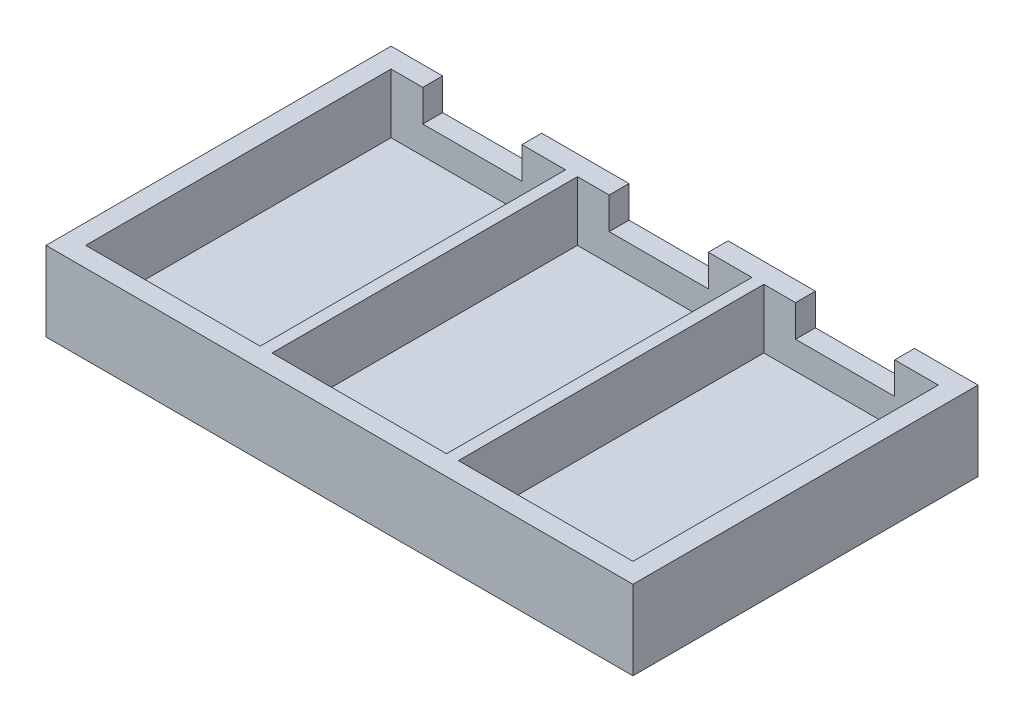
ISO-10303-21;
HEADER;
FILE_DESCRIPTION(('STEP AP214'),'2;1');
FILE_NAME('part.step','',(''),(''),'','','');
FILE_SCHEMA(('AUTOMOTIVE_DESIGN { 1 0 10303 214 1 1 1 1 }'));
ENDSEC;
DATA;
#1=APPLICATION_CONTEXT('core data for automotive mechanical design processes');
#2=APPLICATION_PROTOCOL_DEFINITION('international standard','automotive_design',2000,#1);
#3=PRODUCT_CONTEXT('',#1,'mechanical');
#4=PRODUCT('Part','Part','',(#3));
#5=PRODUCT_RELATED_PRODUCT_CATEGORY('part','',(#4));
#6=PRODUCT_DEFINITION_FORMATION('','',#4);
#7=PRODUCT_DEFINITION_CONTEXT('part definition',#1,'design');
#8=PRODUCT_DEFINITION('design','',#6,#7);
#9=PRODUCT_DEFINITION_SHAPE('','',#8);
#10=(LENGTH_UNIT() NAMED_UNIT(*) SI_UNIT(.MILLI.,.METRE.));
#11=(NAMED_UNIT(*) PLANE_ANGLE_UNIT() SI_UNIT($,.RADIAN.));
#12=(NAMED_UNIT(*) SI_UNIT($,.STERADIAN.) SOLID_ANGLE_UNIT());
#13=UNCERTAINTY_MEASURE_WITH_UNIT(LENGTH_MEASURE(1.E-05),#10,'distance_accuracy_value','');
#14=(GEOMETRIC_REPRESENTATION_CONTEXT(3) GLOBAL_UNCERTAINTY_ASSIGNED_CONTEXT((#13)) GLOBAL_UNIT_ASSIGNED_CONTEXT((#10,
#11,#12)) REPRESENTATION_CONTEXT('',''));
#15=CARTESIAN_POINT('',(0.,0.,0.));
#16=DIRECTION('',(0.,0.,1.));
#17=DIRECTION('',(1.,0.,0.));
#18=AXIS2_PLACEMENT_3D('',#15,#16,#17);
#19=CARTESIAN_POINT('',(0.,20.,38.5));
#20=DIRECTION('',(0.,0.,-1.));
#21=DIRECTION('',(-1.,0.,0.));
#22=AXIS2_PLACEMENT_3D('',#19,#20,#21);
#23=PLANE('',#22);
#24=DIRECTION('',(0.,1.,0.));
#25=VECTOR('',#24,1.);
#26=CARTESIAN_POINT('',(99.,-0.00199999999999853,38.5));
#27=LINE('',#26,#25);
#28=CARTESIAN_POINT('',(99.,5.,38.5));
#29=VERTEX_POINT('',#28);
#30=CARTESIAN_POINT('',(99.,20.,38.5));
#31=VERTEX_POINT('',#30);
#32=EDGE_CURVE('E369',#29,#31,#27,.T.);
#33=ORIENTED_EDGE('',*,*,#32,.T.);
#34=DIRECTION('',(1.,0.,0.));
#35=VECTOR('',#34,1.);
#36=CARTESIAN_POINT('',(0.,20.,38.5));
#37=LINE('',#36,#35);
#38=CARTESIAN_POINT('',(143.,20.,38.4999999999999));
#39=VERTEX_POINT('',#38);
#40=EDGE_CURVE('E445',#31,#39,#37,.T.);
#41=ORIENTED_EDGE('',*,*,#40,.T.);
#42=DIRECTION('',(0.,-1.,0.));
#43=VECTOR('',#42,1.);
#44=CARTESIAN_POINT('',(143.,20.,38.4999999999999));
#45=LINE('',#44,#43);
#46=CARTESIAN_POINT('',(143.,5.,38.4999999999999));
#47=VERTEX_POINT('',#46);
#48=EDGE_CURVE('E416',#39,#47,#45,.T.);
#49=ORIENTED_EDGE('',*,*,#48,.T.);
#50=DIRECTION('',(1.,0.,0.));
#51=VECTOR('',#50,1.);
#52=CARTESIAN_POINT('',(0.,5.,38.5));
#53=LINE('',#52,#51);
#54=EDGE_CURVE('E392',#29,#47,#53,.T.);
#55=ORIENTED_EDGE('',*,*,#54,.F.);
#56=EDGE_LOOP('',(#33,#41,#49,#55));
#57=FACE_BOUND('',#56,.T.);
#58=ADVANCED_FACE('F48',(#57),#23,.T.);
#59=CARTESIAN_POINT('',(148.,20.,-38.5));
#60=DIRECTION('',(0.,0.,1.));
#61=DIRECTION('',(1.,0.,0.));
#62=AXIS2_PLACEMENT_3D('',#59,#60,#61);
#63=PLANE('',#62);
#64=DIRECTION('',(0.,1.,0.));
#65=VECTOR('',#64,1.);
#66=CARTESIAN_POINT('',(107.,-20.4950975679639,-38.5));
#67=LINE('',#66,#65);
#68=CARTESIAN_POINT('',(107.,12.,-38.5));
#69=VERTEX_POINT('',#68);
#70=CARTESIAN_POINT('',(107.,20.,-38.5));
#71=VERTEX_POINT('',#70);
#72=EDGE_CURVE('E328',#69,#71,#67,.T.);
#73=ORIENTED_EDGE('',*,*,#72,.T.);
#74=DIRECTION('',(-1.,0.,0.));
#75=VECTOR('',#74,1.);
#76=CARTESIAN_POINT('',(148.,20.,-38.5));
#77=LINE('',#76,#75);
#78=CARTESIAN_POINT('',(99.,20.,-38.5));
#79=VERTEX_POINT('',#78);
#80=EDGE_CURVE('E457',#71,#79,#77,.T.);
#81=ORIENTED_EDGE('',*,*,#80,.T.);
#82=DIRECTION('',(0.,1.,0.));
#83=VECTOR('',#82,1.);
#84=CARTESIAN_POINT('',(99.,-0.00199999999999853,-38.5));
#85=LINE('',#84,#83);
#86=CARTESIAN_POINT('',(99.,5.,-38.5));
#87=VERTEX_POINT('',#86);
#88=EDGE_CURVE('E364',#87,#79,#85,.T.);
#89=ORIENTED_EDGE('',*,*,#88,.F.);
#90=DIRECTION('',(-1.,0.,0.));
#91=VECTOR('',#90,1.);
#92=CARTESIAN_POINT('',(148.,5.,-38.5));
#93=LINE('',#92,#91);
#94=CARTESIAN_POINT('',(143.,5.,-38.5));
#95=VERTEX_POINT('',#94);
#96=EDGE_CURVE('E434',#95,#87,#93,.T.);
#97=ORIENTED_EDGE('',*,*,#96,.F.);
#98=DIRECTION('',(0.,-1.,0.));
#99=VECTOR('',#98,1.);
#100=CARTESIAN_POINT('',(143.,20.,-38.5));
#101=LINE('',#100,#99);
#102=CARTESIAN_POINT('',(143.,20.,-38.5));
#103=VERTEX_POINT('',#102);
#104=EDGE_CURVE('E421',#103,#95,#101,.T.);
#105=ORIENTED_EDGE('',*,*,#104,.F.);
#106=CARTESIAN_POINT('',(132.,20.,-38.5));
#107=VERTEX_POINT('',#106);
#108=EDGE_CURVE('E453',#103,#107,#77,.T.);
#109=ORIENTED_EDGE('',*,*,#108,.T.);
#110=DIRECTION('',(0.,1.,0.));
#111=VECTOR('',#110,1.);
#112=CARTESIAN_POINT('',(132.,-20.4950975679639,-38.5));
#113=LINE('',#112,#111);
#114=CARTESIAN_POINT('',(132.,12.,-38.5));
#115=VERTEX_POINT('',#114);
#116=EDGE_CURVE('E64',#115,#107,#113,.T.);
#117=ORIENTED_EDGE('',*,*,#116,.F.);
#118=DIRECTION('',(-1.,0.,0.));
#119=VECTOR('',#118,1.);
#120=CARTESIAN_POINT('',(107.,12.,-38.5));
#121=LINE('',#120,#119);
#122=EDGE_CURVE('E323',#115,#69,#121,.T.);
#123=ORIENTED_EDGE('',*,*,#122,.T.);
#124=EDGE_LOOP('',(#73,#81,#89,#97,#105,#109,#117,#123));
#125=FACE_BOUND('',#124,.T.);
#126=ADVANCED_FACE('F508',(#125),#63,.T.);
#127=CARTESIAN_POINT('',(0.,5.,0.));
#128=DIRECTION('',(0.,1.,0.));
#129=DIRECTION('',(0.,0.,1.));
#130=AXIS2_PLACEMENT_3D('',#127,#128,#129);
#131=PLANE('',#130);
#132=DIRECTION('',(0.,0.,1.));
#133=VECTOR('',#132,1.);
#134=CARTESIAN_POINT('',(99.,5.,38.5));
#135=LINE('',#134,#133);
#136=EDGE_CURVE('E353',#87,#29,#135,.T.);
#137=ORIENTED_EDGE('',*,*,#136,.T.);
#138=ORIENTED_EDGE('',*,*,#54,.T.);
#139=DIRECTION('',(0.,0.,-1.));
#140=VECTOR('',#139,1.);
#141=CARTESIAN_POINT('',(143.,5.,43.4999999999999));
#142=LINE('',#141,#140);
#143=EDGE_CURVE('E414',#47,#95,#142,.T.);
#144=ORIENTED_EDGE('',*,*,#143,.T.);
#145=ORIENTED_EDGE('',*,*,#96,.T.);
#146=EDGE_LOOP('',(#137,#138,#144,#145));
#147=FACE_BOUND('',#146,.T.);
#148=ADVANCED_FACE('F518',(#147),#131,.T.);
#149=DIRECTION('',(0.,1.,0.));
#150=VECTOR('',#149,1.);
#151=CARTESIAN_POINT('',(96.,-0.00199999999999853,38.5));
#152=LINE('',#151,#150);
#153=CARTESIAN_POINT('',(96.,5.,38.5));
#154=VERTEX_POINT('',#153);
#155=CARTESIAN_POINT('',(96.,20.,38.5));
#156=VERTEX_POINT('',#155);
#157=EDGE_CURVE('E360',#154,#156,#152,.T.);
#158=ORIENTED_EDGE('',*,*,#157,.F.);
#159=CARTESIAN_POINT('',(52.,5.,38.5));
#160=VERTEX_POINT('',#159);
#161=EDGE_CURVE('E415',#160,#154,#53,.T.);
#162=ORIENTED_EDGE('',*,*,#161,.F.);
#163=DIRECTION('',(0.,1.,0.));
#164=VECTOR('',#163,1.);
#165=CARTESIAN_POINT('',(52.,-0.00199999999999853,38.5));
#166=LINE('',#165,#164);
#167=CARTESIAN_POINT('',(52.,20.,38.5));
#168=VERTEX_POINT('',#167);
#169=EDGE_CURVE('E401',#160,#168,#166,.T.);
#170=ORIENTED_EDGE('',*,*,#169,.T.);
#171=EDGE_CURVE('E450',#168,#156,#37,.T.);
#172=ORIENTED_EDGE('',*,*,#171,.T.);
#173=EDGE_LOOP('',(#158,#162,#170,#172));
#174=FACE_BOUND('',#173,.T.);
#175=ADVANCED_FACE('F511',(#174),#23,.T.);
#176=DIRECTION('',(0.,1.,0.));
#177=VECTOR('',#176,1.);
#178=CARTESIAN_POINT('',(60.,-20.4950975679639,-38.5));
#179=LINE('',#178,#177);
#180=CARTESIAN_POINT('',(60.,12.,-38.5));
#181=VERTEX_POINT('',#180);
#182=CARTESIAN_POINT('',(60.,20.,-38.5));
#183=VERTEX_POINT('',#182);
#184=EDGE_CURVE('E305',#181,#183,#179,.T.);
#185=ORIENTED_EDGE('',*,*,#184,.T.);
#186=CARTESIAN_POINT('',(52.,20.,-38.5));
#187=VERTEX_POINT('',#186);
#188=EDGE_CURVE('E568',#183,#187,#77,.T.);
#189=ORIENTED_EDGE('',*,*,#188,.T.);
#190=DIRECTION('',(0.,1.,0.));
#191=VECTOR('',#190,1.);
#192=CARTESIAN_POINT('',(52.,-0.00199999999999853,-38.5));
#193=LINE('',#192,#191);
#194=CARTESIAN_POINT('',(52.,5.,-38.5));
#195=VERTEX_POINT('',#194);
#196=EDGE_CURVE('E388',#195,#187,#193,.T.);
#197=ORIENTED_EDGE('',*,*,#196,.F.);
#198=CARTESIAN_POINT('',(96.,5.,-38.5));
#199=VERTEX_POINT('',#198);
#200=EDGE_CURVE('E439',#199,#195,#93,.T.);
#201=ORIENTED_EDGE('',*,*,#200,.F.);
#202=DIRECTION('',(0.,1.,0.));
#203=VECTOR('',#202,1.);
#204=CARTESIAN_POINT('',(96.,-0.00199999999999853,-38.5));
#205=LINE('',#204,#203);
#206=CARTESIAN_POINT('',(96.,20.,-38.5));
#207=VERTEX_POINT('',#206);
#208=EDGE_CURVE('E361',#199,#207,#205,.T.);
#209=ORIENTED_EDGE('',*,*,#208,.T.);
#210=CARTESIAN_POINT('',(85.,20.,-38.5));
#211=VERTEX_POINT('',#210);
#212=EDGE_CURVE('E591',#207,#211,#77,.T.);
#213=ORIENTED_EDGE('',*,*,#212,.T.);
#214=DIRECTION('',(0.,1.,0.));
#215=VECTOR('',#214,1.);
#216=CARTESIAN_POINT('',(85.,-20.4950975679639,-38.5));
#217=LINE('',#216,#215);
#218=CARTESIAN_POINT('',(85.,12.,-38.5));
#219=VERTEX_POINT('',#218);
#220=EDGE_CURVE('E72',#219,#211,#217,.T.);
#221=ORIENTED_EDGE('',*,*,#220,.F.);
#222=DIRECTION('',(-1.,0.,0.));
#223=VECTOR('',#222,1.);
#224=CARTESIAN_POINT('',(60.,12.,-38.5));
#225=LINE('',#224,#223);
#226=EDGE_CURVE('E318',#219,#181,#225,.T.);
#227=ORIENTED_EDGE('',*,*,#226,.T.);
#228=EDGE_LOOP('',(#185,#189,#197,#201,#209,#213,#221,#227));
#229=FACE_BOUND('',#228,.T.);
#230=ADVANCED_FACE('F521',(#229),#63,.T.);
#231=DIRECTION('',(0.,0.,-1.));
#232=VECTOR('',#231,1.);
#233=CARTESIAN_POINT('',(96.,5.,-38.5));
#234=LINE('',#233,#232);
#235=EDGE_CURVE('E357',#154,#199,#234,.T.);
#236=ORIENTED_EDGE('',*,*,#235,.T.);
#237=ORIENTED_EDGE('',*,*,#200,.T.);
#238=DIRECTION('',(0.,0.,1.));
#239=VECTOR('',#238,1.);
#240=CARTESIAN_POINT('',(52.,5.,38.5));
#241=LINE('',#240,#239);
#242=EDGE_CURVE('E356',#195,#160,#241,.T.);
#243=ORIENTED_EDGE('',*,*,#242,.T.);
#244=ORIENTED_EDGE('',*,*,#161,.T.);
#245=EDGE_LOOP('',(#236,#237,#243,#244));
#246=FACE_BOUND('',#245,.T.);
#247=ADVANCED_FACE('F559',(#246),#131,.T.);
#248=CARTESIAN_POINT('',(0.,20.,43.5));
#249=DIRECTION('',(0.,0.,-1.));
#250=DIRECTION('',(-1.,0.,0.));
#251=AXIS2_PLACEMENT_3D('',#248,#249,#250);
#252=PLANE('',#251);
#253=DIRECTION('',(1.,0.,0.));
#254=VECTOR('',#253,1.);
#255=CARTESIAN_POINT('',(0.,0.,43.5));
#256=LINE('',#255,#254);
#257=CARTESIAN_POINT('',(0.,0.,43.5));
#258=VERTEX_POINT('',#257);
#259=CARTESIAN_POINT('',(148.,0.,43.4999999999999));
#260=VERTEX_POINT('',#259);
#261=EDGE_CURVE('E420',#258,#260,#256,.T.);
#262=ORIENTED_EDGE('',*,*,#261,.T.);
#263=DIRECTION('',(0.,-1.,0.));
#264=VECTOR('',#263,1.);
#265=CARTESIAN_POINT('',(148.,20.,43.4999999999999));
#266=LINE('',#265,#264);
#267=CARTESIAN_POINT('',(148.,20.,43.4999999999999));
#268=VERTEX_POINT('',#267);
#269=EDGE_CURVE('E13',#268,#260,#266,.T.);
#270=ORIENTED_EDGE('',*,*,#269,.F.);
#271=DIRECTION('',(1.,0.,0.));
#272=VECTOR('',#271,1.);
#273=CARTESIAN_POINT('',(0.,20.,43.5));
#274=LINE('',#273,#272);
#275=CARTESIAN_POINT('',(0.,20.,43.5));
#276=VERTEX_POINT('',#275);
#277=EDGE_CURVE('E272',#276,#268,#274,.T.);
#278=ORIENTED_EDGE('',*,*,#277,.F.);
#279=DIRECTION('',(0.,-1.,0.));
#280=VECTOR('',#279,1.);
#281=CARTESIAN_POINT('',(0.,20.,43.5));
#282=LINE('',#281,#280);
#283=EDGE_CURVE('E281',#276,#258,#282,.T.);
#284=ORIENTED_EDGE('',*,*,#283,.T.);
#285=EDGE_LOOP('',(#262,#270,#278,#284));
#286=FACE_BOUND('',#285,.T.);
#287=ADVANCED_FACE('F50',(#286),#252,.F.);
#288=CARTESIAN_POINT('',(148.,20.,43.4999999999999));
#289=DIRECTION('',(-1.,0.,0.));
#290=DIRECTION('',(0.,0.,1.));
#291=AXIS2_PLACEMENT_3D('',#288,#289,#290);
#292=PLANE('',#291);
#293=DIRECTION('',(0.,0.,-1.));
#294=VECTOR('',#293,1.);
#295=CARTESIAN_POINT('',(148.,0.,43.4999999999999));
#296=LINE('',#295,#294);
#297=CARTESIAN_POINT('',(148.,0.,-43.5));
#298=VERTEX_POINT('',#297);
#299=EDGE_CURVE('E474',#260,#298,#296,.T.);
#300=ORIENTED_EDGE('',*,*,#299,.T.);
#301=DIRECTION('',(0.,-1.,0.));
#302=VECTOR('',#301,1.);
#303=CARTESIAN_POINT('',(148.,20.,-43.5));
#304=LINE('',#303,#302);
#305=CARTESIAN_POINT('',(148.,20.,-43.5));
#306=VERTEX_POINT('',#305);
#307=EDGE_CURVE('E57',#306,#298,#304,.T.);
#308=ORIENTED_EDGE('',*,*,#307,.F.);
#309=DIRECTION('',(0.,0.,-1.));
#310=VECTOR('',#309,1.);
#311=CARTESIAN_POINT('',(148.,20.,43.4999999999999));
#312=LINE('',#311,#310);
#313=EDGE_CURVE('E265',#268,#306,#312,.T.);
#314=ORIENTED_EDGE('',*,*,#313,.F.);
#315=ORIENTED_EDGE('',*,*,#269,.T.);
#316=EDGE_LOOP('',(#300,#308,#314,#315));
#317=FACE_BOUND('',#316,.T.);
#318=ADVANCED_FACE('F494',(#317),#292,.F.);
#319=CARTESIAN_POINT('',(148.,20.,-43.5));
#320=DIRECTION('',(0.,0.,1.));
#321=DIRECTION('',(1.,0.,0.));
#322=AXIS2_PLACEMENT_3D('',#319,#320,#321);
#323=PLANE('',#322);
#324=DIRECTION('',(1.,0.,0.));
#325=VECTOR('',#324,1.);
#326=CARTESIAN_POINT('',(38.,12.,-43.5));
#327=LINE('',#326,#325);
#328=CARTESIAN_POINT('',(13.,12.,-43.5));
#329=VERTEX_POINT('',#328);
#330=CARTESIAN_POINT('',(38.,12.,-43.5));
#331=VERTEX_POINT('',#330);
#332=EDGE_CURVE('E615',#329,#331,#327,.T.);
#333=ORIENTED_EDGE('',*,*,#332,.T.);
#334=DIRECTION('',(0.,1.,0.));
#335=VECTOR('',#334,1.);
#336=CARTESIAN_POINT('',(38.,-20.4950975679639,-43.5));
#337=LINE('',#336,#335);
#338=CARTESIAN_POINT('',(38.,20.,-43.5));
#339=VERTEX_POINT('',#338);
#340=EDGE_CURVE('E604',#331,#339,#337,.T.);
#341=ORIENTED_EDGE('',*,*,#340,.T.);
#342=DIRECTION('',(-1.,0.,0.));
#343=VECTOR('',#342,1.);
#344=CARTESIAN_POINT('',(148.,20.,-43.5));
#345=LINE('',#344,#343);
#346=CARTESIAN_POINT('',(60.,20.,-43.5));
#347=VERTEX_POINT('',#346);
#348=EDGE_CURVE('E264',#347,#339,#345,.T.);
#349=ORIENTED_EDGE('',*,*,#348,.F.);
#350=DIRECTION('',(0.,1.,0.));
#351=VECTOR('',#350,1.);
#352=CARTESIAN_POINT('',(60.,-20.4950975679639,-43.5));
#353=LINE('',#352,#351);
#354=CARTESIAN_POINT('',(60.,12.,-43.5));
#355=VERTEX_POINT('',#354);
#356=EDGE_CURVE('E301',#355,#347,#353,.T.);
#357=ORIENTED_EDGE('',*,*,#356,.F.);
#358=DIRECTION('',(1.,0.,0.));
#359=VECTOR('',#358,1.);
#360=CARTESIAN_POINT('',(85.,12.,-43.5));
#361=LINE('',#360,#359);
#362=CARTESIAN_POINT('',(85.,12.,-43.5));
#363=VERTEX_POINT('',#362);
#364=EDGE_CURVE('E299',#355,#363,#361,.T.);
#365=ORIENTED_EDGE('',*,*,#364,.T.);
#366=DIRECTION('',(0.,1.,0.));
#367=VECTOR('',#366,1.);
#368=CARTESIAN_POINT('',(85.,-20.4950975679639,-43.5));
#369=LINE('',#368,#367);
#370=CARTESIAN_POINT('',(85.,20.,-43.5));
#371=VERTEX_POINT('',#370);
#372=EDGE_CURVE('E296',#363,#371,#369,.T.);
#373=ORIENTED_EDGE('',*,*,#372,.T.);
#374=CARTESIAN_POINT('',(107.,20.,-43.5));
#375=VERTEX_POINT('',#374);
#376=EDGE_CURVE('E271',#375,#371,#345,.T.);
#377=ORIENTED_EDGE('',*,*,#376,.F.);
#378=DIRECTION('',(0.,1.,0.));
#379=VECTOR('',#378,1.);
#380=CARTESIAN_POINT('',(107.,-20.4950975679639,-43.5));
#381=LINE('',#380,#379);
#382=CARTESIAN_POINT('',(107.,12.,-43.5));
#383=VERTEX_POINT('',#382);
#384=EDGE_CURVE('E293',#383,#375,#381,.T.);
#385=ORIENTED_EDGE('',*,*,#384,.F.);
#386=DIRECTION('',(1.,0.,0.));
#387=VECTOR('',#386,1.);
#388=CARTESIAN_POINT('',(132.,12.,-43.5));
#389=LINE('',#388,#387);
#390=CARTESIAN_POINT('',(132.,12.,-43.5));
#391=VERTEX_POINT('',#390);
#392=EDGE_CURVE('E348',#383,#391,#389,.T.);
#393=ORIENTED_EDGE('',*,*,#392,.T.);
#394=DIRECTION('',(0.,1.,0.));
#395=VECTOR('',#394,1.);
#396=CARTESIAN_POINT('',(132.,-20.4950975679639,-43.5));
#397=LINE('',#396,#395);
#398=CARTESIAN_POINT('',(132.,20.,-43.5));
#399=VERTEX_POINT('',#398);
#400=EDGE_CURVE('E335',#391,#399,#397,.T.);
#401=ORIENTED_EDGE('',*,*,#400,.T.);
#402=EDGE_CURVE('E267',#306,#399,#345,.T.);
#403=ORIENTED_EDGE('',*,*,#402,.F.);
#404=ORIENTED_EDGE('',*,*,#307,.T.);
#405=DIRECTION('',(-1.,0.,0.));
#406=VECTOR('',#405,1.);
#407=CARTESIAN_POINT('',(148.,0.,-43.5));
#408=LINE('',#407,#406);
#409=CARTESIAN_POINT('',(0.,0.,-43.5));
#410=VERTEX_POINT('',#409);
#411=EDGE_CURVE('E467',#298,#410,#408,.T.);
#412=ORIENTED_EDGE('',*,*,#411,.T.);
#413=DIRECTION('',(0.,-1.,0.));
#414=VECTOR('',#413,1.);
#415=CARTESIAN_POINT('',(0.,20.,-43.5));
#416=LINE('',#415,#414);
#417=CARTESIAN_POINT('',(0.,20.,-43.5));
#418=VERTEX_POINT('',#417);
#419=EDGE_CURVE('E261',#418,#410,#416,.T.);
#420=ORIENTED_EDGE('',*,*,#419,.F.);
#421=CARTESIAN_POINT('',(13.,20.,-43.5));
#422=VERTEX_POINT('',#421);
#423=EDGE_CURVE('E252',#422,#418,#345,.T.);
#424=ORIENTED_EDGE('',*,*,#423,.F.);
#425=DIRECTION('',(0.,1.,0.));
#426=VECTOR('',#425,1.);
#427=CARTESIAN_POINT('',(13.,-20.4950975679639,-43.5));
#428=LINE('',#427,#426);
#429=EDGE_CURVE('E233',#329,#422,#428,.T.);
#430=ORIENTED_EDGE('',*,*,#429,.F.);
#431=EDGE_LOOP('',(#333,#341,#349,#357,#365,#373,#377,#385,#393,#401,#403,#404,#412,#420,#424,#430));
#432=FACE_BOUND('',#431,.T.);
#433=ADVANCED_FACE('F259',(#432),#323,.F.);
#434=CARTESIAN_POINT('',(0.,20.,-43.5));
#435=DIRECTION('',(1.,0.,0.));
#436=DIRECTION('',(0.,0.,-1.));
#437=AXIS2_PLACEMENT_3D('',#434,#435,#436);
#438=PLANE('',#437);
#439=DIRECTION('',(0.,0.,1.));
#440=VECTOR('',#439,1.);
#441=CARTESIAN_POINT('',(0.,0.,-43.5));
#442=LINE('',#441,#440);
#443=EDGE_CURVE('E463',#410,#258,#442,.T.);
#444=ORIENTED_EDGE('',*,*,#443,.T.);
#445=ORIENTED_EDGE('',*,*,#283,.F.);
#446=DIRECTION('',(0.,0.,1.));
#447=VECTOR('',#446,1.);
#448=CARTESIAN_POINT('',(0.,20.,-43.5));
#449=LINE('',#448,#447);
#450=EDGE_CURVE('E277',#418,#276,#449,.T.);
#451=ORIENTED_EDGE('',*,*,#450,.F.);
#452=ORIENTED_EDGE('',*,*,#419,.T.);
#453=EDGE_LOOP('',(#444,#445,#451,#452));
#454=FACE_BOUND('',#453,.T.);
#455=ADVANCED_FACE('F495',(#454),#438,.F.);
#456=CARTESIAN_POINT('',(0.,20.,0.));
#457=DIRECTION('',(0.,1.,0.));
#458=DIRECTION('',(0.,0.,1.));
#459=AXIS2_PLACEMENT_3D('',#456,#457,#458);
#460=PLANE('',#459);
#461=DIRECTION('',(0.,0.,-1.));
#462=VECTOR('',#461,1.);
#463=CARTESIAN_POINT('',(38.,20.,-38.5));
#464=LINE('',#463,#462);
#465=CARTESIAN_POINT('',(38.,20.,-38.5));
#466=VERTEX_POINT('',#465);
#467=EDGE_CURVE('E246',#466,#339,#464,.T.);
#468=ORIENTED_EDGE('',*,*,#467,.F.);
#469=CARTESIAN_POINT('',(49.,20.,-38.5));
#470=VERTEX_POINT('',#469);
#471=EDGE_CURVE('E458',#470,#466,#77,.T.);
#472=ORIENTED_EDGE('',*,*,#471,.F.);
#473=DIRECTION('',(0.,0.,1.));
#474=VECTOR('',#473,1.);
#475=CARTESIAN_POINT('',(49.,20.,-38.5));
#476=LINE('',#475,#474);
#477=CARTESIAN_POINT('',(49.,20.,38.5));
#478=VERTEX_POINT('',#477);
#479=EDGE_CURVE('E387',#470,#478,#476,.T.);
#480=ORIENTED_EDGE('',*,*,#479,.T.);
#481=CARTESIAN_POINT('',(5.00000000000001,20.,38.5));
#482=VERTEX_POINT('',#481);
#483=EDGE_CURVE('E446',#482,#478,#37,.T.);
#484=ORIENTED_EDGE('',*,*,#483,.F.);
#485=DIRECTION('',(0.,0.,1.));
#486=VECTOR('',#485,1.);
#487=CARTESIAN_POINT('',(4.99999999999999,20.,-43.5));
#488=LINE('',#487,#486);
#489=CARTESIAN_POINT('',(4.99999999999999,20.,-38.5));
#490=VERTEX_POINT('',#489);
#491=EDGE_CURVE('E427',#490,#482,#488,.T.);
#492=ORIENTED_EDGE('',*,*,#491,.F.);
#493=CARTESIAN_POINT('',(13.,20.,-38.5));
#494=VERTEX_POINT('',#493);
#495=EDGE_CURVE('E255',#494,#490,#77,.T.);
#496=ORIENTED_EDGE('',*,*,#495,.F.);
#497=DIRECTION('',(0.,0.,1.));
#498=VECTOR('',#497,1.);
#499=CARTESIAN_POINT('',(13.,20.,-43.5));
#500=LINE('',#499,#498);
#501=EDGE_CURVE('E237',#422,#494,#500,.T.);
#502=ORIENTED_EDGE('',*,*,#501,.F.);
#503=ORIENTED_EDGE('',*,*,#423,.T.);
#504=ORIENTED_EDGE('',*,*,#450,.T.);
#505=ORIENTED_EDGE('',*,*,#277,.T.);
#506=ORIENTED_EDGE('',*,*,#313,.T.);
#507=ORIENTED_EDGE('',*,*,#402,.T.);
#508=DIRECTION('',(0.,0.,-1.));
#509=VECTOR('',#508,1.);
#510=CARTESIAN_POINT('',(132.,20.,-38.5));
#511=LINE('',#510,#509);
#512=EDGE_CURVE('E332',#107,#399,#511,.T.);
#513=ORIENTED_EDGE('',*,*,#512,.F.);
#514=ORIENTED_EDGE('',*,*,#108,.F.);
#515=DIRECTION('',(0.,0.,-1.));
#516=VECTOR('',#515,1.);
#517=CARTESIAN_POINT('',(143.,20.,43.4999999999999));
#518=LINE('',#517,#516);
#519=EDGE_CURVE('E449',#39,#103,#518,.T.);
#520=ORIENTED_EDGE('',*,*,#519,.F.);
#521=ORIENTED_EDGE('',*,*,#40,.F.);
#522=DIRECTION('',(0.,0.,-1.));
#523=VECTOR('',#522,1.);
#524=CARTESIAN_POINT('',(99.,20.,38.5));
#525=LINE('',#524,#523);
#526=EDGE_CURVE('E365',#31,#79,#525,.T.);
#527=ORIENTED_EDGE('',*,*,#526,.T.);
#528=ORIENTED_EDGE('',*,*,#80,.F.);
#529=DIRECTION('',(0.,0.,1.));
#530=VECTOR('',#529,1.);
#531=CARTESIAN_POINT('',(107.,20.,-43.5));
#532=LINE('',#531,#530);
#533=EDGE_CURVE('E289',#375,#71,#532,.T.);
#534=ORIENTED_EDGE('',*,*,#533,.F.);
#535=ORIENTED_EDGE('',*,*,#376,.T.);
#536=DIRECTION('',(0.,0.,-1.));
#537=VECTOR('',#536,1.);
#538=CARTESIAN_POINT('',(85.,20.,-38.5));
#539=LINE('',#538,#537);
#540=EDGE_CURVE('E286',#211,#371,#539,.T.);
#541=ORIENTED_EDGE('',*,*,#540,.F.);
#542=ORIENTED_EDGE('',*,*,#212,.F.);
#543=DIRECTION('',(0.,0.,1.));
#544=VECTOR('',#543,1.);
#545=CARTESIAN_POINT('',(96.,20.,-38.5));
#546=LINE('',#545,#544);
#547=EDGE_CURVE('E379',#207,#156,#546,.T.);
#548=ORIENTED_EDGE('',*,*,#547,.T.);
#549=ORIENTED_EDGE('',*,*,#171,.F.);
#550=DIRECTION('',(0.,0.,-1.));
#551=VECTOR('',#550,1.);
#552=CARTESIAN_POINT('',(52.,20.,38.5));
#553=LINE('',#552,#551);
#554=EDGE_CURVE('E383',#168,#187,#553,.T.);
#555=ORIENTED_EDGE('',*,*,#554,.T.);
#556=ORIENTED_EDGE('',*,*,#188,.F.);
#557=DIRECTION('',(0.,0.,1.));
#558=VECTOR('',#557,1.);
#559=CARTESIAN_POINT('',(60.,20.,-43.5));
#560=LINE('',#559,#558);
#561=EDGE_CURVE('E257',#347,#183,#560,.T.);
#562=ORIENTED_EDGE('',*,*,#561,.F.);
#563=ORIENTED_EDGE('',*,*,#348,.T.);
#564=EDGE_LOOP('',(#468,#472,#480,#484,#492,#496,#502,#503,#504,#505,#506,#507,#513,#514,#520,
#521,#527,#528,#534,#535,#541,#542,#548,#549,#555,#556,#562,#563));
#565=FACE_BOUND('',#564,.T.);
#566=ADVANCED_FACE('F251',(#565),#460,.T.);
#567=CARTESIAN_POINT('',(0.,0.,0.));
#568=DIRECTION('',(0.,1.,0.));
#569=DIRECTION('',(0.,0.,1.));
#570=AXIS2_PLACEMENT_3D('',#567,#568,#569);
#571=PLANE('',#570);
#572=ORIENTED_EDGE('',*,*,#261,.F.);
#573=ORIENTED_EDGE('',*,*,#443,.F.);
#574=ORIENTED_EDGE('',*,*,#411,.F.);
#575=ORIENTED_EDGE('',*,*,#299,.F.);
#576=EDGE_LOOP('',(#572,#573,#574,#575));
#577=FACE_BOUND('',#576,.T.);
#578=ADVANCED_FACE('F488',(#577),#571,.F.);
#579=DIRECTION('',(0.,1.,0.));
#580=VECTOR('',#579,1.);
#581=CARTESIAN_POINT('',(49.,-0.00199999999999853,38.5));
#582=LINE('',#581,#580);
#583=CARTESIAN_POINT('',(49.,5.,38.5));
#584=VERTEX_POINT('',#583);
#585=EDGE_CURVE('E396',#584,#478,#582,.T.);
#586=ORIENTED_EDGE('',*,*,#585,.F.);
#587=CARTESIAN_POINT('',(5.00000000000001,5.,38.5));
#588=VERTEX_POINT('',#587);
#589=EDGE_CURVE('E411',#588,#584,#53,.T.);
#590=ORIENTED_EDGE('',*,*,#589,.F.);
#591=DIRECTION('',(0.,-1.,0.));
#592=VECTOR('',#591,1.);
#593=CARTESIAN_POINT('',(5.00000000000001,20.,38.5));
#594=LINE('',#593,#592);
#595=EDGE_CURVE('E422',#482,#588,#594,.T.);
#596=ORIENTED_EDGE('',*,*,#595,.F.);
#597=ORIENTED_EDGE('',*,*,#483,.T.);
#598=EDGE_LOOP('',(#586,#590,#596,#597));
#599=FACE_BOUND('',#598,.T.);
#600=ADVANCED_FACE('F512',(#599),#23,.T.);
#601=CARTESIAN_POINT('',(143.,20.,43.4999999999999));
#602=DIRECTION('',(-1.,0.,0.));
#603=DIRECTION('',(0.,0.,1.));
#604=AXIS2_PLACEMENT_3D('',#601,#602,#603);
#605=PLANE('',#604);
#606=ORIENTED_EDGE('',*,*,#143,.F.);
#607=ORIENTED_EDGE('',*,*,#48,.F.);
#608=ORIENTED_EDGE('',*,*,#519,.T.);
#609=ORIENTED_EDGE('',*,*,#104,.T.);
#610=EDGE_LOOP('',(#606,#607,#608,#609));
#611=FACE_BOUND('',#610,.T.);
#612=ADVANCED_FACE('F528',(#611),#605,.T.);
#613=DIRECTION('',(0.,1.,0.));
#614=VECTOR('',#613,1.);
#615=CARTESIAN_POINT('',(38.,-20.4950975679639,-38.5));
#616=LINE('',#615,#614);
#617=CARTESIAN_POINT('',(38.,12.,-38.5));
#618=VERTEX_POINT('',#617);
#619=EDGE_CURVE('E599',#618,#466,#616,.T.);
#620=ORIENTED_EDGE('',*,*,#619,.F.);
#621=DIRECTION('',(-1.,0.,0.));
#622=VECTOR('',#621,1.);
#623=CARTESIAN_POINT('',(13.,12.,-38.5));
#624=LINE('',#623,#622);
#625=CARTESIAN_POINT('',(13.,12.,-38.5));
#626=VERTEX_POINT('',#625);
#627=EDGE_CURVE('E601',#618,#626,#624,.T.);
#628=ORIENTED_EDGE('',*,*,#627,.T.);
#629=DIRECTION('',(0.,1.,0.));
#630=VECTOR('',#629,1.);
#631=CARTESIAN_POINT('',(13.,-20.4950975679639,-38.5));
#632=LINE('',#631,#630);
#633=EDGE_CURVE('E245',#626,#494,#632,.T.);
#634=ORIENTED_EDGE('',*,*,#633,.T.);
#635=ORIENTED_EDGE('',*,*,#495,.T.);
#636=DIRECTION('',(0.,-1.,0.));
#637=VECTOR('',#636,1.);
#638=CARTESIAN_POINT('',(4.99999999999999,20.,-38.5));
#639=LINE('',#638,#637);
#640=CARTESIAN_POINT('',(4.99999999999999,5.,-38.5));
#641=VERTEX_POINT('',#640);
#642=EDGE_CURVE('E426',#490,#641,#639,.T.);
#643=ORIENTED_EDGE('',*,*,#642,.T.);
#644=CARTESIAN_POINT('',(49.,5.,-38.5));
#645=VERTEX_POINT('',#644);
#646=EDGE_CURVE('E430',#645,#641,#93,.T.);
#647=ORIENTED_EDGE('',*,*,#646,.F.);
#648=DIRECTION('',(0.,1.,0.));
#649=VECTOR('',#648,1.);
#650=CARTESIAN_POINT('',(49.,-0.00199999999999853,-38.5));
#651=LINE('',#650,#649);
#652=EDGE_CURVE('E393',#645,#470,#651,.T.);
#653=ORIENTED_EDGE('',*,*,#652,.T.);
#654=ORIENTED_EDGE('',*,*,#471,.T.);
#655=EDGE_LOOP('',(#620,#628,#634,#635,#643,#647,#653,#654));
#656=FACE_BOUND('',#655,.T.);
#657=ADVANCED_FACE('F522',(#656),#63,.T.);
#658=CARTESIAN_POINT('',(4.99999999999999,20.,-43.5));
#659=DIRECTION('',(1.,0.,0.));
#660=DIRECTION('',(0.,0.,-1.));
#661=AXIS2_PLACEMENT_3D('',#658,#659,#660);
#662=PLANE('',#661);
#663=DIRECTION('',(0.,0.,1.));
#664=VECTOR('',#663,1.);
#665=CARTESIAN_POINT('',(4.99999999999999,5.,-43.5));
#666=LINE('',#665,#664);
#667=EDGE_CURVE('E438',#641,#588,#666,.T.);
#668=ORIENTED_EDGE('',*,*,#667,.F.);
#669=ORIENTED_EDGE('',*,*,#642,.F.);
#670=ORIENTED_EDGE('',*,*,#491,.T.);
#671=ORIENTED_EDGE('',*,*,#595,.T.);
#672=EDGE_LOOP('',(#668,#669,#670,#671));
#673=FACE_BOUND('',#672,.T.);
#674=ADVANCED_FACE('F598',(#673),#662,.T.);
#675=DIRECTION('',(0.,0.,-1.));
#676=VECTOR('',#675,1.);
#677=CARTESIAN_POINT('',(49.,5.,-38.5));
#678=LINE('',#677,#676);
#679=EDGE_CURVE('E397',#584,#645,#678,.T.);
#680=ORIENTED_EDGE('',*,*,#679,.T.);
#681=ORIENTED_EDGE('',*,*,#646,.T.);
#682=ORIENTED_EDGE('',*,*,#667,.T.);
#683=ORIENTED_EDGE('',*,*,#589,.T.);
#684=EDGE_LOOP('',(#680,#681,#682,#683));
#685=FACE_BOUND('',#684,.T.);
#686=ADVANCED_FACE('F547',(#685),#131,.T.);
#687=CARTESIAN_POINT('',(52.,-0.00199999999999853,38.5));
#688=DIRECTION('',(1.,0.,0.));
#689=DIRECTION('',(0.,0.,-1.));
#690=AXIS2_PLACEMENT_3D('',#687,#688,#689);
#691=PLANE('',#690);
#692=ORIENTED_EDGE('',*,*,#242,.F.);
#693=ORIENTED_EDGE('',*,*,#196,.T.);
#694=ORIENTED_EDGE('',*,*,#554,.F.);
#695=ORIENTED_EDGE('',*,*,#169,.F.);
#696=EDGE_LOOP('',(#692,#693,#694,#695));
#697=FACE_BOUND('',#696,.T.);
#698=ADVANCED_FACE('F572',(#697),#691,.T.);
#699=CARTESIAN_POINT('',(49.,-0.00199999999999853,-38.5));
#700=DIRECTION('',(-1.,0.,0.));
#701=DIRECTION('',(0.,0.,1.));
#702=AXIS2_PLACEMENT_3D('',#699,#700,#701);
#703=PLANE('',#702);
#704=ORIENTED_EDGE('',*,*,#679,.F.);
#705=ORIENTED_EDGE('',*,*,#585,.T.);
#706=ORIENTED_EDGE('',*,*,#479,.F.);
#707=ORIENTED_EDGE('',*,*,#652,.F.);
#708=EDGE_LOOP('',(#704,#705,#706,#707));
#709=FACE_BOUND('',#708,.T.);
#710=ADVANCED_FACE('F544',(#709),#703,.T.);
#711=CARTESIAN_POINT('',(99.,-0.00199999999999853,38.5));
#712=DIRECTION('',(1.,0.,0.));
#713=DIRECTION('',(0.,0.,-1.));
#714=AXIS2_PLACEMENT_3D('',#711,#712,#713);
#715=PLANE('',#714);
#716=ORIENTED_EDGE('',*,*,#136,.F.);
#717=ORIENTED_EDGE('',*,*,#88,.T.);
#718=ORIENTED_EDGE('',*,*,#526,.F.);
#719=ORIENTED_EDGE('',*,*,#32,.F.);
#720=EDGE_LOOP('',(#716,#717,#718,#719));
#721=FACE_BOUND('',#720,.T.);
#722=ADVANCED_FACE('F589',(#721),#715,.T.);
#723=CARTESIAN_POINT('',(96.,-0.00199999999999853,-38.5));
#724=DIRECTION('',(-1.,0.,0.));
#725=DIRECTION('',(0.,0.,1.));
#726=AXIS2_PLACEMENT_3D('',#723,#724,#725);
#727=PLANE('',#726);
#728=ORIENTED_EDGE('',*,*,#235,.F.);
#729=ORIENTED_EDGE('',*,*,#157,.T.);
#730=ORIENTED_EDGE('',*,*,#547,.F.);
#731=ORIENTED_EDGE('',*,*,#208,.F.);
#732=EDGE_LOOP('',(#728,#729,#730,#731));
#733=FACE_BOUND('',#732,.T.);
#734=ADVANCED_FACE('F637',(#733),#727,.T.);
#735=CARTESIAN_POINT('',(38.,-20.4950975679639,-38.5));
#736=DIRECTION('',(1.,0.,0.));
#737=DIRECTION('',(0.,0.,-1.));
#738=AXIS2_PLACEMENT_3D('',#735,#736,#737);
#739=PLANE('',#738);
#740=DIRECTION('',(0.,0.,1.));
#741=VECTOR('',#740,1.);
#742=CARTESIAN_POINT('',(38.,12.,-38.5));
#743=LINE('',#742,#741);
#744=EDGE_CURVE('E626',#331,#618,#743,.T.);
#745=ORIENTED_EDGE('',*,*,#744,.T.);
#746=ORIENTED_EDGE('',*,*,#619,.T.);
#747=ORIENTED_EDGE('',*,*,#467,.T.);
#748=ORIENTED_EDGE('',*,*,#340,.F.);
#749=EDGE_LOOP('',(#745,#746,#747,#748));
#750=FACE_BOUND('',#749,.T.);
#751=ADVANCED_FACE('F625',(#750),#739,.F.);
#752=CARTESIAN_POINT('',(13.,-20.4950975679639,-43.5));
#753=DIRECTION('',(-1.,0.,0.));
#754=DIRECTION('',(0.,0.,1.));
#755=AXIS2_PLACEMENT_3D('',#752,#753,#754);
#756=PLANE('',#755);
#757=DIRECTION('',(0.,0.,-1.));
#758=VECTOR('',#757,1.);
#759=CARTESIAN_POINT('',(13.,12.,-43.5));
#760=LINE('',#759,#758);
#761=EDGE_CURVE('E239',#626,#329,#760,.T.);
#762=ORIENTED_EDGE('',*,*,#761,.T.);
#763=ORIENTED_EDGE('',*,*,#429,.T.);
#764=ORIENTED_EDGE('',*,*,#501,.T.);
#765=ORIENTED_EDGE('',*,*,#633,.F.);
#766=EDGE_LOOP('',(#762,#763,#764,#765));
#767=FACE_BOUND('',#766,.T.);
#768=ADVANCED_FACE('F235',(#767),#756,.F.);
#769=CARTESIAN_POINT('',(0.,12.,0.));
#770=DIRECTION('',(0.,1.,0.));
#771=DIRECTION('',(0.,0.,1.));
#772=AXIS2_PLACEMENT_3D('',#769,#770,#771);
#773=PLANE('',#772);
#774=ORIENTED_EDGE('',*,*,#332,.F.);
#775=ORIENTED_EDGE('',*,*,#761,.F.);
#776=ORIENTED_EDGE('',*,*,#627,.F.);
#777=ORIENTED_EDGE('',*,*,#744,.F.);
#778=EDGE_LOOP('',(#774,#775,#776,#777));
#779=FACE_BOUND('',#778,.T.);
#780=ADVANCED_FACE('F681',(#779),#773,.T.);
#781=CARTESIAN_POINT('',(107.,-20.4950975679639,-43.5));
#782=DIRECTION('',(-1.,0.,0.));
#783=DIRECTION('',(0.,0.,1.));
#784=AXIS2_PLACEMENT_3D('',#781,#782,#783);
#785=PLANE('',#784);
#786=DIRECTION('',(0.,0.,-1.));
#787=VECTOR('',#786,1.);
#788=CARTESIAN_POINT('',(107.,12.,-43.5));
#789=LINE('',#788,#787);
#790=EDGE_CURVE('E327',#69,#383,#789,.T.);
#791=ORIENTED_EDGE('',*,*,#790,.T.);
#792=ORIENTED_EDGE('',*,*,#384,.T.);
#793=ORIENTED_EDGE('',*,*,#533,.T.);
#794=ORIENTED_EDGE('',*,*,#72,.F.);
#795=EDGE_LOOP('',(#791,#792,#793,#794));
#796=FACE_BOUND('',#795,.T.);
#797=ADVANCED_FACE('F689',(#796),#785,.F.);
#798=CARTESIAN_POINT('',(132.,-20.4950975679639,-38.5));
#799=DIRECTION('',(1.,0.,0.));
#800=DIRECTION('',(0.,0.,-1.));
#801=AXIS2_PLACEMENT_3D('',#798,#799,#800);
#802=PLANE('',#801);
#803=DIRECTION('',(0.,0.,1.));
#804=VECTOR('',#803,1.);
#805=CARTESIAN_POINT('',(132.,12.,-38.5));
#806=LINE('',#805,#804);
#807=EDGE_CURVE('E341',#391,#115,#806,.T.);
#808=ORIENTED_EDGE('',*,*,#807,.T.);
#809=ORIENTED_EDGE('',*,*,#116,.T.);
#810=ORIENTED_EDGE('',*,*,#512,.T.);
#811=ORIENTED_EDGE('',*,*,#400,.F.);
#812=EDGE_LOOP('',(#808,#809,#810,#811));
#813=FACE_BOUND('',#812,.T.);
#814=ADVANCED_FACE('F698',(#813),#802,.F.);
#815=CARTESIAN_POINT('',(0.,12.,0.));
#816=DIRECTION('',(0.,1.,0.));
#817=DIRECTION('',(0.,0.,1.));
#818=AXIS2_PLACEMENT_3D('',#815,#816,#817);
#819=PLANE('',#818);
#820=ORIENTED_EDGE('',*,*,#790,.F.);
#821=ORIENTED_EDGE('',*,*,#122,.F.);
#822=ORIENTED_EDGE('',*,*,#807,.F.);
#823=ORIENTED_EDGE('',*,*,#392,.F.);
#824=EDGE_LOOP('',(#820,#821,#822,#823));
#825=FACE_BOUND('',#824,.T.);
#826=ADVANCED_FACE('F707',(#825),#819,.T.);
#827=CARTESIAN_POINT('',(60.,-20.4950975679639,-43.5));
#828=DIRECTION('',(-1.,0.,0.));
#829=DIRECTION('',(0.,0.,1.));
#830=AXIS2_PLACEMENT_3D('',#827,#828,#829);
#831=PLANE('',#830);
#832=DIRECTION('',(0.,0.,-1.));
#833=VECTOR('',#832,1.);
#834=CARTESIAN_POINT('',(60.,12.,-43.5));
#835=LINE('',#834,#833);
#836=EDGE_CURVE('E315',#181,#355,#835,.T.);
#837=ORIENTED_EDGE('',*,*,#836,.T.);
#838=ORIENTED_EDGE('',*,*,#356,.T.);
#839=ORIENTED_EDGE('',*,*,#561,.T.);
#840=ORIENTED_EDGE('',*,*,#184,.F.);
#841=EDGE_LOOP('',(#837,#838,#839,#840));
#842=FACE_BOUND('',#841,.T.);
#843=ADVANCED_FACE('F715',(#842),#831,.F.);
#844=CARTESIAN_POINT('',(85.,-20.4950975679639,-38.5));
#845=DIRECTION('',(1.,0.,0.));
#846=DIRECTION('',(0.,0.,-1.));
#847=AXIS2_PLACEMENT_3D('',#844,#845,#846);
#848=PLANE('',#847);
#849=DIRECTION('',(0.,0.,1.));
#850=VECTOR('',#849,1.);
#851=CARTESIAN_POINT('',(85.,12.,-38.5));
#852=LINE('',#851,#850);
#853=EDGE_CURVE('E307',#363,#219,#852,.T.);
#854=ORIENTED_EDGE('',*,*,#853,.T.);
#855=ORIENTED_EDGE('',*,*,#220,.T.);
#856=ORIENTED_EDGE('',*,*,#540,.T.);
#857=ORIENTED_EDGE('',*,*,#372,.F.);
#858=EDGE_LOOP('',(#854,#855,#856,#857));
#859=FACE_BOUND('',#858,.T.);
#860=ADVANCED_FACE('F723',(#859),#848,.F.);
#861=CARTESIAN_POINT('',(0.,12.,0.));
#862=DIRECTION('',(0.,1.,0.));
#863=DIRECTION('',(0.,0.,1.));
#864=AXIS2_PLACEMENT_3D('',#861,#862,#863);
#865=PLANE('',#864);
#866=ORIENTED_EDGE('',*,*,#836,.F.);
#867=ORIENTED_EDGE('',*,*,#226,.F.);
#868=ORIENTED_EDGE('',*,*,#853,.F.);
#869=ORIENTED_EDGE('',*,*,#364,.F.);
#870=EDGE_LOOP('',(#866,#867,#868,#869));
#871=FACE_BOUND('',#870,.T.);
#872=ADVANCED_FACE('F731',(#871),#865,.T.);
#873=CLOSED_SHELL('',(#58,#126,#148,#175,#230,#247,#287,#318,#433,#455,#566,#578,#600,#612,#657,
#674,#686,#698,#710,#722,#734,#751,#768,#780,#797,#814,#826,#843,#860,#872));
#874=MANIFOLD_SOLID_BREP('B2',#873);
#875=ADVANCED_BREP_SHAPE_REPRESENTATION('',(#18,#874),#14);
#876=SHAPE_DEFINITION_REPRESENTATION(#9,#875);
ENDSEC;
END-ISO-10303-21;
